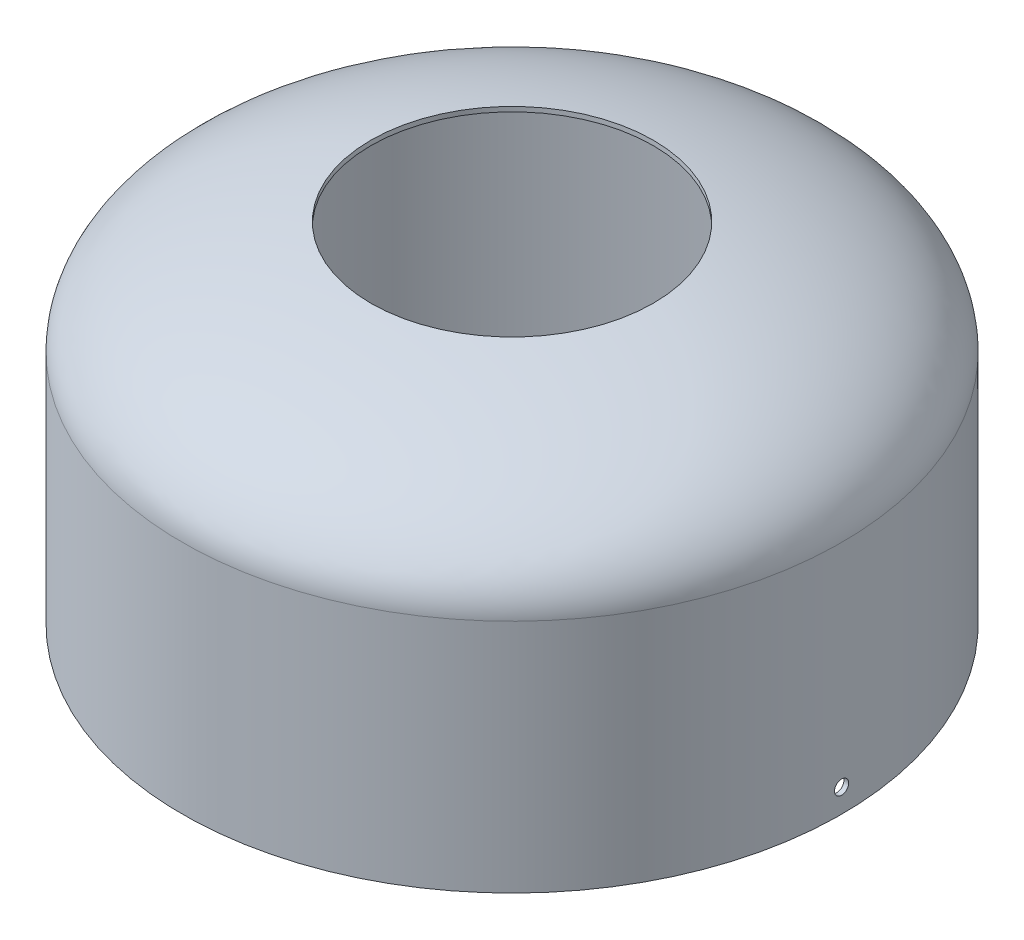
ISO-10303-21;
HEADER;
FILE_DESCRIPTION(('STEP AP214'),'2;1');
FILE_NAME('part.step','',(''),(''),'','','');
FILE_SCHEMA(('AUTOMOTIVE_DESIGN { 1 0 10303 214 1 1 1 1 }'));
ENDSEC;
DATA;
#1=APPLICATION_CONTEXT('core data for automotive mechanical design processes');
#2=APPLICATION_PROTOCOL_DEFINITION('international standard','automotive_design',2000,#1);
#3=PRODUCT_CONTEXT('',#1,'mechanical');
#4=PRODUCT('Part','Part','',(#3));
#5=PRODUCT_RELATED_PRODUCT_CATEGORY('part','',(#4));
#6=PRODUCT_DEFINITION_FORMATION('','',#4);
#7=PRODUCT_DEFINITION_CONTEXT('part definition',#1,'design');
#8=PRODUCT_DEFINITION('design','',#6,#7);
#9=PRODUCT_DEFINITION_SHAPE('','',#8);
#10=(LENGTH_UNIT() NAMED_UNIT(*) SI_UNIT(.MILLI.,.METRE.));
#11=(NAMED_UNIT(*) PLANE_ANGLE_UNIT() SI_UNIT($,.RADIAN.));
#12=(NAMED_UNIT(*) SI_UNIT($,.STERADIAN.) SOLID_ANGLE_UNIT());
#13=UNCERTAINTY_MEASURE_WITH_UNIT(LENGTH_MEASURE(1.E-05),#10,'distance_accuracy_value','');
#14=(GEOMETRIC_REPRESENTATION_CONTEXT(3) GLOBAL_UNCERTAINTY_ASSIGNED_CONTEXT((#13)) GLOBAL_UNIT_ASSIGNED_CONTEXT((#10,
#11,#12)) REPRESENTATION_CONTEXT('',''));
#15=CARTESIAN_POINT('',(0.,0.,0.));
#16=DIRECTION('',(0.,0.,1.));
#17=DIRECTION('',(1.,0.,0.));
#18=AXIS2_PLACEMENT_3D('',#15,#16,#17);
#19=CARTESIAN_POINT('',(175.26,-127.,0.));
#20=DIRECTION('',(0.,-1.,0.));
#21=DIRECTION('',(0.,0.,-1.));
#22=AXIS2_PLACEMENT_3D('',#19,#20,#21);
#23=PLANE('',#22);
#24=CARTESIAN_POINT('',(0.,-127.,0.));
#25=DIRECTION('',(0.,-1.,0.));
#26=DIRECTION('',(0.,0.,-1.));
#27=AXIS2_PLACEMENT_3D('',#24,#25,#26);
#28=CIRCLE('',#27,177.8);
#29=CARTESIAN_POINT('',(0.,-127.,-177.8));
#30=VERTEX_POINT('',#29);
#31=EDGE_CURVE('E10',#30,#30,#28,.T.);
#32=ORIENTED_EDGE('',*,*,#31,.T.);
#33=EDGE_LOOP('',(#32));
#34=FACE_BOUND('',#33,.T.);
#35=CARTESIAN_POINT('',(0.,-127.,0.));
#36=DIRECTION('',(0.,-1.,0.));
#37=DIRECTION('',(0.,0.,-1.));
#38=AXIS2_PLACEMENT_3D('',#35,#36,#37);
#39=CIRCLE('',#38,175.26);
#40=CARTESIAN_POINT('',(0.,-127.,-175.26));
#41=VERTEX_POINT('',#40);
#42=EDGE_CURVE('E90',#41,#41,#39,.T.);
#43=ORIENTED_EDGE('',*,*,#42,.F.);
#44=EDGE_LOOP('',(#43));
#45=FACE_BOUND('',#44,.T.);
#46=ADVANCED_FACE('F31',(#34,#45),#23,.T.);
#47=CARTESIAN_POINT('',(0.,-109.728,0.));
#48=DIRECTION('',(0.,-1.,0.));
#49=DIRECTION('',(0.,0.,-1.));
#50=AXIS2_PLACEMENT_3D('',#47,#48,#49);
#51=CYLINDRICAL_SURFACE('',#50,177.8);
#52=CARTESIAN_POINT('',(-177.8,-118.11,0.));
#53=CARTESIAN_POINT('',(-177.799999448996,-118.109990518853,0.21398301791727));
#54=CARTESIAN_POINT('',(-177.799609559963,-118.091912440641,0.428120568401189));
#55=CARTESIAN_POINT('',(-177.798091696613,-118.020047278849,0.850496402015067));
#56=CARTESIAN_POINT('',(-177.796962837365,-117.966217380623,1.05872729948726));
#57=CARTESIAN_POINT('',(-177.794094893813,-117.824383317824,1.46310965523662));
#58=CARTESIAN_POINT('',(-177.792356104617,-117.736395677827,1.65926690133471));
#59=CARTESIAN_POINT('',(-177.7884645162,-117.528766990613,2.03397105502064));
#60=CARTESIAN_POINT('',(-177.786311819003,-117.409133740848,2.21252228585864));
#61=CARTESIAN_POINT('',(-177.781834137803,-117.14156530509,2.5470555175017));
#62=CARTESIAN_POINT('',(-177.779509111204,-116.993623107295,2.70303190993257));
#63=CARTESIAN_POINT('',(-177.774949198715,-116.673646768913,2.98794129346663));
#64=CARTESIAN_POINT('',(-177.772714316393,-116.501611675865,3.11687321492112));
#65=CARTESIAN_POINT('',(-177.768586592744,-116.138320520813,3.34403599713843));
#66=CARTESIAN_POINT('',(-177.766693777971,-115.947062968479,3.44226447501306));
#67=CARTESIAN_POINT('',(-177.763463898654,-115.550766825202,3.60521610224696));
#68=CARTESIAN_POINT('',(-177.762126832426,-115.345728276024,3.66993935314479));
#69=CARTESIAN_POINT('',(-177.760159447207,-114.927723696963,3.76403391121373));
#70=CARTESIAN_POINT('',(-177.759529019573,-114.714758890896,3.79341065273888));
#71=CARTESIAN_POINT('',(-177.759045664959,-114.286919647586,3.81599499762068));
#72=CARTESIAN_POINT('',(-177.759192735708,-114.072045215919,3.80920270655515));
#73=CARTESIAN_POINT('',(-177.760247691633,-113.64652312676,3.75964649492027));
#74=CARTESIAN_POINT('',(-177.761155451993,-113.435874781653,3.71688847563732));
#75=CARTESIAN_POINT('',(-177.763629254073,-113.02474675021,3.59662366081761));
#76=CARTESIAN_POINT('',(-177.765195296873,-112.82426708056,3.51911680826428));
#77=CARTESIAN_POINT('',(-177.768809259149,-112.439148490935,3.3315477107282));
#78=CARTESIAN_POINT('',(-177.770857218688,-112.254510889712,3.22148275887896));
#79=CARTESIAN_POINT('',(-177.775204092919,-111.906332191332,2.97192388438966));
#80=CARTESIAN_POINT('',(-177.777503007852,-111.742791114595,2.83242993326627));
#81=CARTESIAN_POINT('',(-177.782093179524,-111.441413380289,2.52793936824549));
#82=CARTESIAN_POINT('',(-177.784384434627,-111.303581901309,2.3629376286229));
#83=CARTESIAN_POINT('',(-177.78870053279,-111.05757580039,2.01213343102005));
#84=CARTESIAN_POINT('',(-177.79072537581,-110.949401182759,1.82633097001727));
#85=CARTESIAN_POINT('',(-177.794280393813,-110.765780142544,1.43919683059193));
#86=CARTESIAN_POINT('',(-177.79581056642,-110.690333877186,1.23786507757225));
#87=CARTESIAN_POINT('',(-177.798203701941,-110.574314496466,0.82538878897589));
#88=CARTESIAN_POINT('',(-177.799066665796,-110.53374133191,0.61424426724203));
#89=CARTESIAN_POINT('',(-177.800027980798,-110.488626223019,0.188181136896937));
#90=CARTESIAN_POINT('',(-177.80012648397,-110.484077114797,-0.0267367128150626));
#91=CARTESIAN_POINT('',(-177.799548175507,-110.511120591547,-0.45428519354407));
#92=CARTESIAN_POINT('',(-177.798871364314,-110.542713155962,-0.666915825861952));
#93=CARTESIAN_POINT('',(-177.796818816141,-110.641137242059,-1.08383403674813));
#94=CARTESIAN_POINT('',(-177.795443143561,-110.707965516771,-1.28812238218907));
#95=CARTESIAN_POINT('',(-177.792147928843,-110.874960686808,-1.68258045309771));
#96=CARTESIAN_POINT('',(-177.79022838618,-110.975127614243,-1.87275016496636));
#97=CARTESIAN_POINT('',(-177.786061376998,-111.205975149353,-2.23360567319873));
#98=CARTESIAN_POINT('',(-177.78381385865,-111.33666058171,-2.40428838249616));
#99=CARTESIAN_POINT('',(-177.779244412696,-111.6248283346,-2.72129380483743));
#100=CARTESIAN_POINT('',(-177.776922484979,-111.782310695333,-2.86761648133608));
#101=CARTESIAN_POINT('',(-177.772465557048,-112.119632574159,-3.13177206734941));
#102=CARTESIAN_POINT('',(-177.770330587206,-112.29947571318,-3.2496003535864));
#103=CARTESIAN_POINT('',(-177.766488758413,-112.676395378343,-3.45339074403121));
#104=CARTESIAN_POINT('',(-177.764781898749,-112.873471875745,-3.53935290138256));
#105=CARTESIAN_POINT('',(-177.761988946152,-113.279246487587,-3.67696282003563));
#106=CARTESIAN_POINT('',(-177.760902798826,-113.487943581931,-3.7286135881819));
#107=CARTESIAN_POINT('',(-177.759473574802,-113.911049850614,-3.79614442951742));
#108=CARTESIAN_POINT('',(-177.759130498429,-114.125459027437,-3.81202448714609));
#109=CARTESIAN_POINT('',(-177.759226117577,-114.553856462438,-3.80756270999915));
#110=CARTESIAN_POINT('',(-177.75966465512,-114.767844796924,-3.7872281949202));
#111=CARTESIAN_POINT('',(-177.761273731789,-115.189369794868,-3.71092948225812));
#112=CARTESIAN_POINT('',(-177.762444272377,-115.396906445437,-3.65496521350043));
#113=CARTESIAN_POINT('',(-177.765385383824,-115.799641272239,-3.50899597775791));
#114=CARTESIAN_POINT('',(-177.767155965448,-115.994839226996,-3.41899039994779));
#115=CARTESIAN_POINT('',(-177.771097465883,-116.367348025153,-3.20749789174011));
#116=CARTESIAN_POINT('',(-177.773268369608,-116.544659542205,-3.08601214758738));
#117=CARTESIAN_POINT('',(-177.777766127739,-116.876391395508,-2.81499351728572));
#118=CARTESIAN_POINT('',(-177.780092997054,-117.030809539033,-2.66545794762979));
#119=CARTESIAN_POINT('',(-177.784640832591,-117.312390211253,-2.34254131628953));
#120=CARTESIAN_POINT('',(-177.786861772399,-117.439545969174,-2.16915434848137));
#121=CARTESIAN_POINT('',(-177.790947930215,-117.663003758447,-1.80340742923208));
#122=CARTESIAN_POINT('',(-177.792812946779,-117.759288338315,-1.61103682640601));
#123=CARTESIAN_POINT('',(-177.795973123213,-117.918082537504,-1.21300667022607));
#124=CARTESIAN_POINT('',(-177.797268964048,-117.980632537558,-1.0073633362939));
#125=CARTESIAN_POINT('',(-177.798797460663,-118.053559303169,-0.667012744971216));
#126=CARTESIAN_POINT('',(-177.79924646314,-118.074698039282,-0.534515817590875));
#127=CARTESIAN_POINT('',(-177.799847905371,-118.102921356321,-0.268032807340111));
#128=CARTESIAN_POINT('',(-177.800000345169,-118.110005939335,-0.134046724690925));
#129=CARTESIAN_POINT('',(-177.8,-118.11,0.));
#130=B_SPLINE_CURVE_WITH_KNOTS('',3,(#52,#53,#54,#55,#56,#57,#58,#59,#60,#61,#62,#63,#64,#65,
#66,#67,#68,#69,#70,#71,#72,#73,#74,#75,#76,#77,#78,#79,#80,#81,#82,#83,#84,#85,#86,#87,#88,#89,
#90,#91,#92,#93,#94,#95,#96,#97,#98,#99,#100,#101,#102,#103,#104,#105,#106,#107,#108,#109,#110,
#111,#112,#113,#114,#115,#116,#117,#118,#119,#120,#121,#122,#123,#124,#125,#126,#127,#128,#129),
.UNSPECIFIED.,.T.,.F.,(4,2,2,2,2,2,2,2,2,2,2,2,2,2,2,2,2,2,2,2,2,2,2,2,2,2,2,2,2,2,2,2,2,2,2,2,
2,2,4),(0.,0.641459774526896,1.28368911862873,1.92560815621276,2.56736917258052,
3.20928935201202,3.85123491554811,4.49323028798963,5.13522371483453,5.77711842569259,
6.41901126285376,7.06079879824831,7.70258738670435,8.34442934819387,8.98627193090332,
9.62824365830205,10.2702154789846,10.9121903836608,11.5541643827346,12.1960107131109,
12.8378566784126,13.4796435079811,14.1214309557108,14.76331993262,15.4052098724895,
16.0472038906462,16.6891968381368,17.3311335177878,17.9730704766869,18.6148777018848,
19.2566862091709,19.8985062333896,20.5403020758743,21.182159349858,21.8241758486962,
22.4665546423226,23.1081627838003,23.5099965153157,23.9118301871333),.UNSPECIFIED.);
#131=CARTESIAN_POINT('',(-177.8,-118.11,0.));
#132=VERTEX_POINT('',#131);
#133=EDGE_CURVE('E71',#132,#132,#130,.T.);
#134=ORIENTED_EDGE('',*,*,#133,.F.);
#135=EDGE_LOOP('',(#134));
#136=FACE_BOUND('',#135,.T.);
#137=CARTESIAN_POINT('',(177.759173884219,-114.3,-3.81));
#138=CARTESIAN_POINT('',(177.759174435725,-114.086016988444,-3.80999051884686));
#139=CARTESIAN_POINT('',(177.759564416868,-113.8718794443,-3.79191244167328));
#140=CARTESIAN_POINT('',(177.761082608574,-113.449503623857,-3.72004728438159));
#141=CARTESIAN_POINT('',(177.76221170424,-113.241272733221,-3.66621738959598));
#142=CARTESIAN_POINT('',(177.765080161263,-112.836890391924,-3.52438333686193));
#143=CARTESIAN_POINT('',(177.766819227491,-112.640733153382,-3.43639570365495));
#144=CARTESIAN_POINT('',(177.770711288956,-112.266029012333,-3.22876703242594));
#145=CARTESIAN_POINT('',(177.772864182192,-112.087477786585,-3.10913379183863));
#146=CARTESIAN_POINT('',(177.777342089039,-111.752944549096,-2.84156536530985));
#147=CARTESIAN_POINT('',(177.779667145218,-111.596968147365,-2.69362316552119));
#148=CARTESIAN_POINT('',(177.784226937045,-111.312058745909,-2.37364681925877));
#149=CARTESIAN_POINT('',(177.786461669118,-111.183126815804,-2.20161172034928));
#150=CARTESIAN_POINT('',(177.790588978361,-110.955964024618,-1.83832056025995));
#151=CARTESIAN_POINT('',(177.792481528988,-110.857735544815,-1.64706300975726));
#152=CARTESIAN_POINT('',(177.795710881833,-110.694783913508,-1.25076687046128));
#153=CARTESIAN_POINT('',(177.797047685735,-110.63006066049,-1.04572832342415));
#154=CARTESIAN_POINT('',(177.799014663336,-110.535966097878,-0.62772375052077));
#155=CARTESIAN_POINT('',(177.79964494566,-110.506589353782,-0.414758948502668));
#156=CARTESIAN_POINT('',(177.800128190169,-110.484005002357,0.0130802869083813));
#157=CARTESIAN_POINT('',(177.799981154623,-110.490797289477,0.227954714726706));
#158=CARTESIAN_POINT('',(177.798926434311,-110.540353494947,0.653476821510701));
#159=CARTESIAN_POINT('',(177.798018874249,-110.583111515982,0.864125187628158));
#160=CARTESIAN_POINT('',(177.795545549887,-110.70337634162,1.27525326019022));
#161=CARTESIAN_POINT('',(177.793979784509,-110.780883203201,1.47573294996065));
#162=CARTESIAN_POINT('',(177.790366332964,-110.968452319257,1.86085156365125));
#163=CARTESIAN_POINT('',(177.788318606762,-111.078517278465,2.04548916986143));
#164=CARTESIAN_POINT('',(177.783972052612,-111.328076168565,2.39366787507695));
#165=CARTESIAN_POINT('',(177.781673224421,-111.467570127947,2.55720895365997));
#166=CARTESIAN_POINT('',(177.777083041961,-111.772060698725,2.85858667832812));
#167=CARTESIAN_POINT('',(177.774791689288,-111.937062434186,2.99641814750047));
#168=CARTESIAN_POINT('',(177.770475254075,-112.287866620006,3.24242423062928));
#169=CARTESIAN_POINT('',(177.768450171573,-112.4736690734,3.35059884025684));
#170=CARTESIAN_POINT('',(177.76489463769,-112.860803210981,3.53421987475118));
#171=CARTESIAN_POINT('',(177.763364188723,-113.062134970956,3.60966613988271));
#172=CARTESIAN_POINT('',(177.76097058475,-113.474611274637,3.72568551800833));
#173=CARTESIAN_POINT('',(177.760107428801,-113.685755804488,3.766258680237));
#174=CARTESIAN_POINT('',(177.759145898339,-114.111818938261,3.81137378038854));
#175=CARTESIAN_POINT('',(177.759047371722,-114.326736783048,3.81592288441786));
#176=CARTESIAN_POINT('',(177.759625811937,-114.754285252913,3.78887940104097));
#177=CARTESIAN_POINT('',(177.760302778328,-114.966915879291,3.75728683419117));
#178=CARTESIAN_POINT('',(177.762355747626,-115.383834062388,3.65886274912239));
#179=CARTESIAN_POINT('',(177.763731686073,-115.588122386561,3.59203448033139));
#180=CARTESIAN_POINT('',(177.767027426566,-115.982580417563,3.42503932928261));
#181=CARTESIAN_POINT('',(177.768947229137,-116.172750110779,3.32487241487903));
#182=CARTESIAN_POINT('',(177.773114638742,-116.53360560684,3.09402489864228));
#183=CARTESIAN_POINT('',(177.775362297622,-116.704288320496,2.96333946881064));
#184=CARTESIAN_POINT('',(177.779931843286,-117.021293752814,2.67517171852956));
#185=CARTESIAN_POINT('',(177.782253730181,-117.167616434948,2.51768935790009));
#186=CARTESIAN_POINT('',(177.786710413153,-117.431772032376,2.18036747650606));
#187=CARTESIAN_POINT('',(177.788845178833,-117.549600324395,2.00052433481663));
#188=CARTESIAN_POINT('',(177.792686525253,-117.753390725002,1.62360466284606));
#189=CARTESIAN_POINT('',(177.794393106707,-117.839352886734,1.4265281613058));
#190=CARTESIAN_POINT('',(177.797185550913,-117.976962808458,1.02075355269705));
#191=CARTESIAN_POINT('',(177.798271468088,-118.028613577187,0.812056466367646));
#192=CARTESIAN_POINT('',(177.799700380675,-118.096144422407,0.38895021452569));
#193=CARTESIAN_POINT('',(177.800043375763,-118.112024483295,0.174541046521621));
#194=CARTESIAN_POINT('',(177.799947778732,-118.107562715326,-0.253856394691798));
#195=CARTESIAN_POINT('',(177.799509344474,-118.087228202301,-0.467844744169991));
#196=CARTESIAN_POINT('',(177.797900613413,-118.010929488458,-0.889369772591552));
#197=CARTESIAN_POINT('',(177.796730315149,-117.954965216492,-1.09690643865096));
#198=CARTESIAN_POINT('',(177.793789721404,-117.808995968855,-1.49964129533512));
#199=CARTESIAN_POINT('',(177.792019415158,-117.718990382386,-1.69483926449552));
#200=CARTESIAN_POINT('',(177.788078377657,-117.507497852432,-2.06734808782128));
#201=CARTESIAN_POINT('',(177.785907661492,-117.386012095205,-2.24465961564773));
#202=CARTESIAN_POINT('',(177.781410108947,-117.114993450889,-2.57639146745206));
#203=CARTESIAN_POINT('',(177.77908325766,-116.965457883254,-2.73080960112517));
#204=CARTESIAN_POINT('',(177.774535280323,-116.642541259959,-3.01239025441565));
#205=CARTESIAN_POINT('',(177.772314180644,-116.469154298154,-3.13954600323365));
#206=CARTESIAN_POINT('',(177.768227595294,-116.103407383419,-3.36300378312234));
#207=CARTESIAN_POINT('',(177.766362311027,-115.91103677804,-3.45928836096262));
#208=CARTESIAN_POINT('',(177.763201608965,-115.513006616377,-3.61808255564339));
#209=CARTESIAN_POINT('',(177.761905510193,-115.307363279528,-3.68063255325057));
#210=CARTESIAN_POINT('',(177.760376693309,-114.96701269479,-3.75355931170635));
#211=CARTESIAN_POINT('',(177.75992759142,-114.834515777415,-3.77469804460862));
#212=CARTESIAN_POINT('',(177.759326014155,-114.568032787228,-3.80292135737967));
#213=CARTESIAN_POINT('',(177.759173538736,-114.434046714636,-3.81000593933799));
#214=CARTESIAN_POINT('',(177.759173884219,-114.3,-3.81));
#215=B_SPLINE_CURVE_WITH_KNOTS('',3,(#137,#138,#139,#140,#141,#142,#143,#144,#145,#146,#147,
#148,#149,#150,#151,#152,#153,#154,#155,#156,#157,#158,#159,#160,#161,#162,#163,#164,#165,#166,
#167,#168,#169,#170,#171,#172,#173,#174,#175,#176,#177,#178,#179,#180,#181,#182,#183,#184,#185,
#186,#187,#188,#189,#190,#191,#192,#193,#194,#195,#196,#197,#198,#199,#200,#201,#202,#203,#204,
#205,#206,#207,#208,#209,#210,#211,#212,#213,#214),.UNSPECIFIED.,.T.,.F.,(4,2,2,2,2,2,2,2,2,2,2,
2,2,2,2,2,2,2,2,2,2,2,2,2,2,2,2,2,2,2,2,2,2,2,2,2,2,2,4),(0.,0.641459755423829,1.28368908083734,
1.92560809663075,2.56736909154353,3.2092892959611,3.8512348838081,4.49323024690478,
5.13522366485573,5.77711836415874,6.41901119024316,7.060798785404,7.70258743290791,
8.34442941134711,8.98627201111154,9.62824371375618,10.2702155101069,10.9121904396553,
11.5541644628485,12.1960107777819,12.8378567276506,13.4796434969899,14.1214308851547,
14.7633198723017,15.4052098219224,16.0472038497386,16.6891968068913,17.3311334607932,
17.9730703947026,18.6148776634084,19.2566862137156,19.8985062804236,20.5403021650848,
21.1821594134156,21.8241758871916,22.4665546920129,23.1081628440509,23.5099965454497,
23.9118301871053),.UNSPECIFIED.);
#216=CARTESIAN_POINT('',(177.759173884219,-114.3,-3.81));
#217=VERTEX_POINT('',#216);
#218=EDGE_CURVE('E67',#217,#217,#215,.T.);
#219=ORIENTED_EDGE('',*,*,#218,.F.);
#220=EDGE_LOOP('',(#219));
#221=FACE_BOUND('',#220,.T.);
#222=CARTESIAN_POINT('',(0.,0.,0.));
#223=DIRECTION('',(0.,-1.,0.));
#224=DIRECTION('',(0.,0.,-1.));
#225=AXIS2_PLACEMENT_3D('',#222,#223,#224);
#226=CIRCLE('',#225,177.8);
#227=CARTESIAN_POINT('',(0.,0.,-177.8));
#228=VERTEX_POINT('',#227);
#229=EDGE_CURVE('E42',#228,#228,#226,.T.);
#230=ORIENTED_EDGE('',*,*,#229,.T.);
#231=EDGE_LOOP('',(#230));
#232=FACE_BOUND('',#231,.T.);
#233=ORIENTED_EDGE('',*,*,#31,.F.);
#234=EDGE_LOOP('',(#233));
#235=FACE_BOUND('',#234,.T.);
#236=ADVANCED_FACE('F75',(#136,#221,#232,#235),#51,.T.);
#237=CARTESIAN_POINT('',(0.,0.,0.));
#238=DIRECTION('',(0.,0.,1.));
#239=DIRECTION('',(1.,0.,0.));
#240=AXIS2_PLACEMENT_3D('',#237,#238,#239);
#241=ELLIPSE('',#240,177.8,67.4703561573525);
#242=TRIMMED_CURVE('',#241,(PARAMETER_VALUE(-1.5707963267949)),
(PARAMETER_VALUE(1.5707963267949)),.T.,.PARAMETER.);
#243=CARTESIAN_POINT('',(0.,-109.728,0.));
#244=DIRECTION('',(0.,-1.,0.));
#245=AXIS1_PLACEMENT('',#243,#244);
#246=SURFACE_OF_REVOLUTION('',#242,#245);
#247=CARTESIAN_POINT('',(0.,60.96,0.));
#248=DIRECTION('',(0.,-1.,0.));
#249=DIRECTION('',(0.,0.,-1.));
#250=AXIS2_PLACEMENT_3D('',#247,#248,#249);
#251=CIRCLE('',#250,76.2);
#252=CARTESIAN_POINT('',(0.,60.96,-76.2));
#253=VERTEX_POINT('',#252);
#254=EDGE_CURVE('E47',#253,#253,#251,.T.);
#255=ORIENTED_EDGE('',*,*,#254,.T.);
#256=EDGE_LOOP('',(#255));
#257=FACE_BOUND('',#256,.T.);
#258=ORIENTED_EDGE('',*,*,#229,.F.);
#259=EDGE_LOOP('',(#258));
#260=FACE_BOUND('',#259,.T.);
#261=ADVANCED_FACE('F79',(#257,#260),#246,.F.);
#262=CARTESIAN_POINT('',(0.,-109.728,0.));
#263=DIRECTION('',(0.,-1.,0.));
#264=DIRECTION('',(0.,0.,-1.));
#265=AXIS2_PLACEMENT_3D('',#262,#263,#264);
#266=CYLINDRICAL_SURFACE('',#265,76.2);
#267=CARTESIAN_POINT('',(0.,58.42,0.));
#268=DIRECTION('',(0.,-1.,0.));
#269=DIRECTION('',(0.,0.,-1.));
#270=AXIS2_PLACEMENT_3D('',#267,#268,#269);
#271=CIRCLE('',#270,76.2);
#272=CARTESIAN_POINT('',(0.,58.42,-76.2));
#273=VERTEX_POINT('',#272);
#274=EDGE_CURVE('E113',#273,#273,#271,.T.);
#275=ORIENTED_EDGE('',*,*,#274,.T.);
#276=EDGE_LOOP('',(#275));
#277=FACE_BOUND('',#276,.T.);
#278=ORIENTED_EDGE('',*,*,#254,.F.);
#279=EDGE_LOOP('',(#278));
#280=FACE_BOUND('',#279,.T.);
#281=ADVANCED_FACE('F84',(#277,#280),#266,.F.);
#282=CARTESIAN_POINT('',(0.,0.,0.));
#283=DIRECTION('',(0.,0.,-1.));
#284=DIRECTION('',(1.,0.,0.));
#285=AXIS2_PLACEMENT_3D('',#282,#283,#284);
#286=ELLIPSE('',#285,175.26,64.8725161095741);
#287=TRIMMED_CURVE('',#286,(PARAMETER_VALUE(4.71238898038469)),
(PARAMETER_VALUE(7.85398163397448)),.T.,.PARAMETER.);
#288=CARTESIAN_POINT('',(0.,-109.728,0.));
#289=DIRECTION('',(0.,-1.,0.));
#290=AXIS1_PLACEMENT('',#288,#289);
#291=SURFACE_OF_REVOLUTION('',#287,#290);
#292=CARTESIAN_POINT('',(0.,0.,0.));
#293=DIRECTION('',(0.,-1.,0.));
#294=DIRECTION('',(0.,0.,-1.));
#295=AXIS2_PLACEMENT_3D('',#292,#293,#294);
#296=CIRCLE('',#295,175.26);
#297=CARTESIAN_POINT('',(0.,0.,-175.26));
#298=VERTEX_POINT('',#297);
#299=EDGE_CURVE('E112',#298,#298,#296,.T.);
#300=ORIENTED_EDGE('',*,*,#299,.T.);
#301=EDGE_LOOP('',(#300));
#302=FACE_BOUND('',#301,.T.);
#303=ORIENTED_EDGE('',*,*,#274,.F.);
#304=EDGE_LOOP('',(#303));
#305=FACE_BOUND('',#304,.T.);
#306=ADVANCED_FACE('F92',(#302,#305),#291,.F.);
#307=CARTESIAN_POINT('',(0.,-109.728,0.));
#308=DIRECTION('',(0.,-1.,0.));
#309=DIRECTION('',(0.,0.,-1.));
#310=AXIS2_PLACEMENT_3D('',#307,#308,#309);
#311=CYLINDRICAL_SURFACE('',#310,175.26);
#312=CARTESIAN_POINT('',(-175.21858206252,-114.3,-3.81));
#313=CARTESIAN_POINT('',(-175.218582622,-114.086017758117,-3.80999051911178));
#314=CARTESIAN_POINT('',(-175.218978254891,-113.871881002458,-3.79191257147633));
#315=CARTESIAN_POINT('',(-175.220518447904,-113.449506790068,-3.72004795871354));
#316=CARTESIAN_POINT('',(-175.221663905856,-113.24127671816,-3.66621848412492));
#317=CARTESIAN_POINT('',(-175.224573929197,-112.836896018496,-3.5243856132079));
#318=CARTESIAN_POINT('',(-175.226338195074,-112.640739600815,-3.43639874734359));
#319=CARTESIAN_POINT('',(-175.230286652513,-112.266036938665,-3.22877195337368));
#320=CARTESIAN_POINT('',(-175.232470740623,-112.087486372181,-3.10913982047411));
#321=CARTESIAN_POINT('',(-175.237013541544,-111.752953455316,-2.84157332720554));
#322=CARTESIAN_POINT('',(-175.239372298269,-111.596976809591,-2.69363183463562));
#323=CARTESIAN_POINT('',(-175.243998185013,-111.312066743511,-2.37365686047942));
#324=CARTESIAN_POINT('',(-175.246265311406,-111.183134392992,-2.20162242625802));
#325=CARTESIAN_POINT('',(-175.250452460356,-110.955970252171,-1.83833193166336));
#326=CARTESIAN_POINT('',(-175.252372455009,-110.857740929402,-1.64707432799938));
#327=CARTESIAN_POINT('',(-175.255648641599,-110.694787676475,-1.25077779883803));
#328=CARTESIAN_POINT('',(-175.257004835261,-110.630063643805,-1.04573891550784));
#329=CARTESIAN_POINT('',(-175.259000344421,-110.535967892763,-0.627734384507146));
#330=CARTESIAN_POINT('',(-175.259639773377,-110.506590579303,-0.414769996880578));
#331=CARTESIAN_POINT('',(-175.260130048434,-110.484004980441,0.0130685348322969));
#332=CARTESIAN_POINT('',(-175.259980896862,-110.49079658831,0.227942673281357));
#333=CARTESIAN_POINT('',(-175.258910924389,-110.540351213239,0.65346324868938));
#334=CARTESIAN_POINT('',(-175.257990233701,-110.583108160457,0.864110392893159));
#335=CARTESIAN_POINT('',(-175.255481113908,-110.703370379548,1.2752362022628));
#336=CARTESIAN_POINT('',(-175.253892683696,-110.780875708989,1.47571485058193));
#337=CARTESIAN_POINT('',(-175.250226912789,-110.968441544044,1.86083215204759));
#338=CARTESIAN_POINT('',(-175.248149530289,-111.078504833501,2.04546944894985));
#339=CARTESIAN_POINT('',(-175.243740015292,-111.328060157727,2.39364789486132));
#340=CARTESIAN_POINT('',(-175.241407882539,-111.467552222163,2.55718902260318));
#341=CARTESIAN_POINT('',(-175.236751171117,-111.772039806648,2.85856820832407));
#342=CARTESIAN_POINT('',(-175.234426594111,-111.937040600257,2.99640093843456));
#343=CARTESIAN_POINT('',(-175.230047556622,-112.287843206666,3.2424097092028));
#344=CARTESIAN_POINT('',(-175.22799309618,-112.473645022513,3.35058574551656));
#345=CARTESIAN_POINT('',(-175.224385967045,-112.860778294337,3.53420974356387));
#346=CARTESIAN_POINT('',(-175.222833300878,-113.062109828442,3.60965754063309));
#347=CARTESIAN_POINT('',(-175.220404933112,-113.474586059256,3.72567995263599));
#348=CARTESIAN_POINT('',(-175.219529230532,-113.685730741718,3.76625461819735));
#349=CARTESIAN_POINT('',(-175.218553699603,-114.111793243089,3.81137246730549));
#350=CARTESIAN_POINT('',(-175.218453712441,-114.326710280644,3.81592302616334));
#351=CARTESIAN_POINT('',(-175.219040471554,-114.754257376736,3.78888269867635));
#352=CARTESIAN_POINT('',(-175.219727217369,-114.966887436615,3.75729183353592));
#353=CARTESIAN_POINT('',(-175.221809877017,-115.383804161387,3.65887152288225));
#354=CARTESIAN_POINT('',(-175.223205723543,-115.588091616179,3.592045421902));
#355=CARTESIAN_POINT('',(-175.226549165178,-115.982548298968,3.4250550116485));
#356=CARTESIAN_POINT('',(-175.228496760835,-116.172717512901,3.32489066916594));
#357=CARTESIAN_POINT('',(-175.232724525066,-116.533573419684,3.09404808877415));
#358=CARTESIAN_POINT('',(-175.235004747773,-116.704256933213,2.96336488191768));
#359=CARTESIAN_POINT('',(-175.239640510693,-117.021264407078,2.67520151302959));
#360=CARTESIAN_POINT('',(-175.241996051021,-117.167588330108,2.51772130996048));
#361=CARTESIAN_POINT('',(-175.246517356445,-117.431747515972,2.18040272066965));
#362=CARTESIAN_POINT('',(-175.248683089807,-117.549578020742,2.0005606078565));
#363=CARTESIAN_POINT('',(-175.252580177564,-117.753372971665,1.62364247605001));
#364=CARTESIAN_POINT('',(-175.254311532691,-117.839337471529,1.42656648610563));
#365=CARTESIAN_POINT('',(-175.257144531383,-117.976951890107,1.02079287645776));
#366=CARTESIAN_POINT('',(-175.25824623176,-118.02860490477,0.812096307129358));
#367=CARTESIAN_POINT('',(-175.259695948326,-118.09614028426,0.388990634006447));
#368=CARTESIAN_POINT('',(-175.260043964216,-118.112022634911,0.174581527948048));
#369=CARTESIAN_POINT('',(-175.259947080621,-118.107565416485,-0.253814910794548));
#370=CARTESIAN_POINT('',(-175.259502345915,-118.087233374811,-0.467802321875661));
#371=CARTESIAN_POINT('',(-175.257870409081,-118.010939940228,-0.889325873112971));
#372=CARTESIAN_POINT('',(-175.256683205471,-117.95497847619,-1.09686200038906));
#373=CARTESIAN_POINT('',(-175.253700099594,-117.80901514907,-1.49959622905615));
#374=CARTESIAN_POINT('',(-175.251904186422,-117.719012676195,-1.69479410935292));
#375=CARTESIAN_POINT('',(-175.247906117197,-117.507526605491,-2.06730333069148));
#376=CARTESIAN_POINT('',(-175.245703976433,-117.386044192461,-2.24461534454757));
#377=CARTESIAN_POINT('',(-175.241141275595,-117.115031532296,-2.57634983803304));
#378=CARTESIAN_POINT('',(-175.238780699471,-116.965498440829,-2.73076999358835));
#379=CARTESIAN_POINT('',(-175.234166778377,-116.642586400245,-3.01235513335379));
#380=CARTESIAN_POINT('',(-175.231913460152,-116.46920154522,-3.13951334725357));
#381=CARTESIAN_POINT('',(-175.227767562798,-116.103457853002,-3.36297674069649));
#382=CARTESIAN_POINT('',(-175.225875188901,-115.911088314962,-3.45926438843039));
#383=CARTESIAN_POINT('',(-175.222668553943,-115.51305959785,-3.61806482189372));
#384=CARTESIAN_POINT('',(-175.221353602106,-115.307416637732,-3.68061798507998));
#385=CARTESIAN_POINT('',(-175.219802476397,-114.967057619566,-3.7535516527044));
#386=CARTESIAN_POINT('',(-175.219346801525,-114.834551911384,-3.77469325089809));
#387=CARTESIAN_POINT('',(-175.218736419357,-114.568051016431,-3.80292039326871));
#388=CARTESIAN_POINT('',(-175.218581712016,-114.434055829888,-3.81000593959726));
#389=CARTESIAN_POINT('',(-175.21858206252,-114.3,-3.81));
#390=B_SPLINE_CURVE_WITH_KNOTS('',3,(#312,#313,#314,#315,#316,#317,#318,#319,#320,#321,#322,
#323,#324,#325,#326,#327,#328,#329,#330,#331,#332,#333,#334,#335,#336,#337,#338,#339,#340,#341,
#342,#343,#344,#345,#346,#347,#348,#349,#350,#351,#352,#353,#354,#355,#356,#357,#358,#359,#360,
#361,#362,#363,#364,#365,#366,#367,#368,#369,#370,#371,#372,#373,#374,#375,#376,#377,#378,#379,
#380,#381,#382,#383,#384,#385,#386,#387,#388,#389),.UNSPECIFIED.,.T.,.F.,(4,2,2,2,2,2,2,2,2,2,2,
2,2,2,2,2,2,2,2,2,2,2,2,2,2,2,2,2,2,2,2,2,2,2,2,2,2,2,4),(0.,0.641457412865004,1.28368430542869,
1.92560077906873,2.56735927588033,3.20927966936697,3.85122545156142,4.49322281221779,
5.13521820861581,5.77711196918132,6.41900383561917,7.06078739221733,7.70257201206122,
8.34441152305292,8.98625168108681,9.62822470814081,10.2701978292285,10.9121741802135,
11.5541495991964,12.1959935814462,12.8378371871222,13.4796198798876,14.1214032119554,
14.7632911093023,15.4051799896589,16.0471759839275,16.6891708960852,17.3311078727281,
17.9730451037753,18.614848919478,19.2566540164716,19.8984706109825,20.5402630532092,
21.182120608244,21.8241373798922,22.4665181182734,23.1081282625779,23.5099892685468,
23.9118502130008),.UNSPECIFIED.);
#391=CARTESIAN_POINT('',(-175.21858206252,-114.3,-3.81));
#392=VERTEX_POINT('',#391);
#393=EDGE_CURVE('E34',#392,#392,#390,.T.);
#394=ORIENTED_EDGE('',*,*,#393,.F.);
#395=EDGE_LOOP('',(#394));
#396=FACE_BOUND('',#395,.T.);
#397=CARTESIAN_POINT('',(175.21858206252,-114.3,-3.81));
#398=CARTESIAN_POINT('',(175.218582622,-114.513982241883,-3.80999051911178));
#399=CARTESIAN_POINT('',(175.218978254891,-114.728118997542,-3.79191257147633));
#400=CARTESIAN_POINT('',(175.220518447904,-115.150493209932,-3.72004795871354));
#401=CARTESIAN_POINT('',(175.221663905856,-115.35872328184,-3.66621848412492));
#402=CARTESIAN_POINT('',(175.224573929197,-115.763103981504,-3.5243856132079));
#403=CARTESIAN_POINT('',(175.226338195074,-115.959260399185,-3.43639874734359));
#404=CARTESIAN_POINT('',(175.230286652513,-116.333963061335,-3.22877195337368));
#405=CARTESIAN_POINT('',(175.232470740623,-116.512513627819,-3.10913982047411));
#406=CARTESIAN_POINT('',(175.237013541544,-116.847046544684,-2.84157332720553));
#407=CARTESIAN_POINT('',(175.239372298269,-117.003023190409,-2.69363183463562));
#408=CARTESIAN_POINT('',(175.243998185013,-117.287933256489,-2.37365686047942));
#409=CARTESIAN_POINT('',(175.246265311406,-117.416865607008,-2.20162242625802));
#410=CARTESIAN_POINT('',(175.250452460356,-117.644029747829,-1.83833193166336));
#411=CARTESIAN_POINT('',(175.252372455009,-117.742259070598,-1.64707432799938));
#412=CARTESIAN_POINT('',(175.255648641599,-117.905212323525,-1.25077779883803));
#413=CARTESIAN_POINT('',(175.257004835261,-117.969936356195,-1.04573891550784));
#414=CARTESIAN_POINT('',(175.259000344421,-118.064032107237,-0.627734384507146));
#415=CARTESIAN_POINT('',(175.259639773377,-118.093409420697,-0.414769996880578));
#416=CARTESIAN_POINT('',(175.260130048434,-118.115995019559,0.0130685348322969));
#417=CARTESIAN_POINT('',(175.259980896862,-118.10920341169,0.227942673281357));
#418=CARTESIAN_POINT('',(175.258910924389,-118.059648786761,0.653463248689378));
#419=CARTESIAN_POINT('',(175.257990233701,-118.016891839543,0.864110392893157));
#420=CARTESIAN_POINT('',(175.255481113908,-117.896629620452,1.2752362022628));
#421=CARTESIAN_POINT('',(175.253892683696,-117.819124291011,1.47571485058192));
#422=CARTESIAN_POINT('',(175.250226912789,-117.631558455956,1.86083215204759));
#423=CARTESIAN_POINT('',(175.248149530289,-117.521495166499,2.04546944894985));
#424=CARTESIAN_POINT('',(175.243740015292,-117.271939842273,2.39364789486132));
#425=CARTESIAN_POINT('',(175.241407882539,-117.132447777837,2.55718902260318));
#426=CARTESIAN_POINT('',(175.236751171117,-116.827960193352,2.85856820832407));
#427=CARTESIAN_POINT('',(175.234426594111,-116.662959399743,2.99640093843456));
#428=CARTESIAN_POINT('',(175.230047556622,-116.312156793334,3.2424097092028));
#429=CARTESIAN_POINT('',(175.22799309618,-116.126354977487,3.35058574551656));
#430=CARTESIAN_POINT('',(175.224385967045,-115.739221705663,3.53420974356387));
#431=CARTESIAN_POINT('',(175.222833300878,-115.537890171558,3.60965754063309));
#432=CARTESIAN_POINT('',(175.220404933112,-115.125413940744,3.72567995263599));
#433=CARTESIAN_POINT('',(175.219529230532,-114.914269258282,3.76625461819735));
#434=CARTESIAN_POINT('',(175.218553699603,-114.488206756911,3.81137246730549));
#435=CARTESIAN_POINT('',(175.218453712441,-114.273289719356,3.81592302616334));
#436=CARTESIAN_POINT('',(175.219040471554,-113.845742623264,3.78888269867635));
#437=CARTESIAN_POINT('',(175.219727217369,-113.633112563385,3.75729183353592));
#438=CARTESIAN_POINT('',(175.221809877017,-113.216195838613,3.65887152288225));
#439=CARTESIAN_POINT('',(175.223205723543,-113.011908383821,3.592045421902));
#440=CARTESIAN_POINT('',(175.226549165178,-112.617451701032,3.4250550116485));
#441=CARTESIAN_POINT('',(175.228496760835,-112.427282487099,3.32489066916594));
#442=CARTESIAN_POINT('',(175.232724525066,-112.066426580316,3.09404808877415));
#443=CARTESIAN_POINT('',(175.235004747773,-111.895743066787,2.96336488191768));
#444=CARTESIAN_POINT('',(175.239640510693,-111.578735592922,2.67520151302959));
#445=CARTESIAN_POINT('',(175.241996051021,-111.432411669892,2.51772130996048));
#446=CARTESIAN_POINT('',(175.246517356445,-111.168252484028,2.18040272066965));
#447=CARTESIAN_POINT('',(175.248683089807,-111.050421979258,2.0005606078565));
#448=CARTESIAN_POINT('',(175.252580177564,-110.846627028335,1.62364247605001));
#449=CARTESIAN_POINT('',(175.254311532691,-110.760662528471,1.42656648610563));
#450=CARTESIAN_POINT('',(175.257144531383,-110.623048109893,1.02079287645776));
#451=CARTESIAN_POINT('',(175.25824623176,-110.57139509523,0.812096307129358));
#452=CARTESIAN_POINT('',(175.259695948326,-110.50385971574,0.388990634006447));
#453=CARTESIAN_POINT('',(175.260043964216,-110.487977365089,0.174581527948048));
#454=CARTESIAN_POINT('',(175.259947080621,-110.492434583515,-0.253814910794548));
#455=CARTESIAN_POINT('',(175.259502345915,-110.512766625189,-0.467802321875659));
#456=CARTESIAN_POINT('',(175.257870409081,-110.589060059772,-0.88932587311297));
#457=CARTESIAN_POINT('',(175.256683205471,-110.64502152381,-1.09686200038906));
#458=CARTESIAN_POINT('',(175.253700099594,-110.79098485093,-1.49959622905616));
#459=CARTESIAN_POINT('',(175.251904186422,-110.880987323805,-1.69479410935292));
#460=CARTESIAN_POINT('',(175.247906117197,-111.092473394509,-2.06730333069149));
#461=CARTESIAN_POINT('',(175.245703976433,-111.213955807539,-2.24461534454757));
#462=CARTESIAN_POINT('',(175.241141275595,-111.484968467704,-2.57634983803304));
#463=CARTESIAN_POINT('',(175.238780699471,-111.634501559171,-2.73076999358836));
#464=CARTESIAN_POINT('',(175.234166778377,-111.957413599755,-3.0123551333538));
#465=CARTESIAN_POINT('',(175.231913460152,-112.13079845478,-3.13951334725358));
#466=CARTESIAN_POINT('',(175.227767562798,-112.496542146998,-3.36297674069649));
#467=CARTESIAN_POINT('',(175.225875188901,-112.688911685038,-3.45926438843039));
#468=CARTESIAN_POINT('',(175.222668553943,-113.08694040215,-3.61806482189372));
#469=CARTESIAN_POINT('',(175.221353602106,-113.292583362268,-3.68061798507998));
#470=CARTESIAN_POINT('',(175.219802476397,-113.632942380434,-3.7535516527044));
#471=CARTESIAN_POINT('',(175.219346801525,-113.765448088616,-3.77469325089809));
#472=CARTESIAN_POINT('',(175.218736419357,-114.031948983569,-3.80292039326871));
#473=CARTESIAN_POINT('',(175.218581712016,-114.165944170112,-3.81000593959726));
#474=CARTESIAN_POINT('',(175.21858206252,-114.3,-3.81));
#475=B_SPLINE_CURVE_WITH_KNOTS('',3,(#397,#398,#399,#400,#401,#402,#403,#404,#405,#406,#407,
#408,#409,#410,#411,#412,#413,#414,#415,#416,#417,#418,#419,#420,#421,#422,#423,#424,#425,#426,
#427,#428,#429,#430,#431,#432,#433,#434,#435,#436,#437,#438,#439,#440,#441,#442,#443,#444,#445,
#446,#447,#448,#449,#450,#451,#452,#453,#454,#455,#456,#457,#458,#459,#460,#461,#462,#463,#464,
#465,#466,#467,#468,#469,#470,#471,#472,#473,#474),.UNSPECIFIED.,.T.,.F.,(4,2,2,2,2,2,2,2,2,2,2,
2,2,2,2,2,2,2,2,2,2,2,2,2,2,2,2,2,2,2,2,2,2,2,2,2,2,2,4),(0.,0.641457412865004,1.28368430542869,
1.92560077906873,2.56735927588033,3.20927966936699,3.85122545156143,4.49322281221779,
5.13521820861581,5.77711196918132,6.41900383561917,7.06078739221733,7.70257201206122,
8.34441152305292,8.98625168108681,9.62822470814081,10.2701978292285,10.9121741802135,
11.5541495991964,12.1959935814462,12.8378371871222,13.4796198798876,14.1214032119554,
14.7632911093023,15.4051799896589,16.0471759839275,16.6891708960852,17.3311078727281,
17.9730451037753,18.6148489194779,19.2566540164716,19.8984706109825,20.5402630532092,
21.1821206082441,21.8241373798922,22.4665181182734,23.1081282625779,23.5099892685468,
23.9118502130008),.UNSPECIFIED.);
#476=CARTESIAN_POINT('',(175.21858206252,-114.3,-3.81));
#477=VERTEX_POINT('',#476);
#478=EDGE_CURVE('E50',#477,#477,#475,.T.);
#479=ORIENTED_EDGE('',*,*,#478,.F.);
#480=EDGE_LOOP('',(#479));
#481=FACE_BOUND('',#480,.T.);
#482=ORIENTED_EDGE('',*,*,#42,.T.);
#483=EDGE_LOOP('',(#482));
#484=FACE_BOUND('',#483,.T.);
#485=ORIENTED_EDGE('',*,*,#299,.F.);
#486=EDGE_LOOP('',(#485));
#487=FACE_BOUND('',#486,.T.);
#488=ADVANCED_FACE('F54',(#396,#481,#484,#487),#311,.F.);
#489=CARTESIAN_POINT('',(-177.8,-114.3,0.));
#490=DIRECTION('',(1.,0.,0.));
#491=DIRECTION('',(0.,0.,-1.));
#492=AXIS2_PLACEMENT_3D('',#489,#490,#491);
#493=CYLINDRICAL_SURFACE('',#492,3.81);
#494=ORIENTED_EDGE('',*,*,#218,.T.);
#495=EDGE_LOOP('',(#494));
#496=FACE_BOUND('',#495,.T.);
#497=ORIENTED_EDGE('',*,*,#478,.T.);
#498=EDGE_LOOP('',(#497));
#499=FACE_BOUND('',#498,.T.);
#500=ADVANCED_FACE('F57',(#496,#499),#493,.F.);
#501=ORIENTED_EDGE('',*,*,#133,.T.);
#502=EDGE_LOOP('',(#501));
#503=FACE_BOUND('',#502,.T.);
#504=ORIENTED_EDGE('',*,*,#393,.T.);
#505=EDGE_LOOP('',(#504));
#506=FACE_BOUND('',#505,.T.);
#507=ADVANCED_FACE('F60',(#503,#506),#493,.F.);
#508=CLOSED_SHELL('',(#46,#236,#261,#281,#306,#488,#500,#507));
#509=MANIFOLD_SOLID_BREP('B2',#508);
#510=ADVANCED_BREP_SHAPE_REPRESENTATION('',(#18,#509),#14);
#511=SHAPE_DEFINITION_REPRESENTATION(#9,#510);
ENDSEC;
END-ISO-10303-21;
